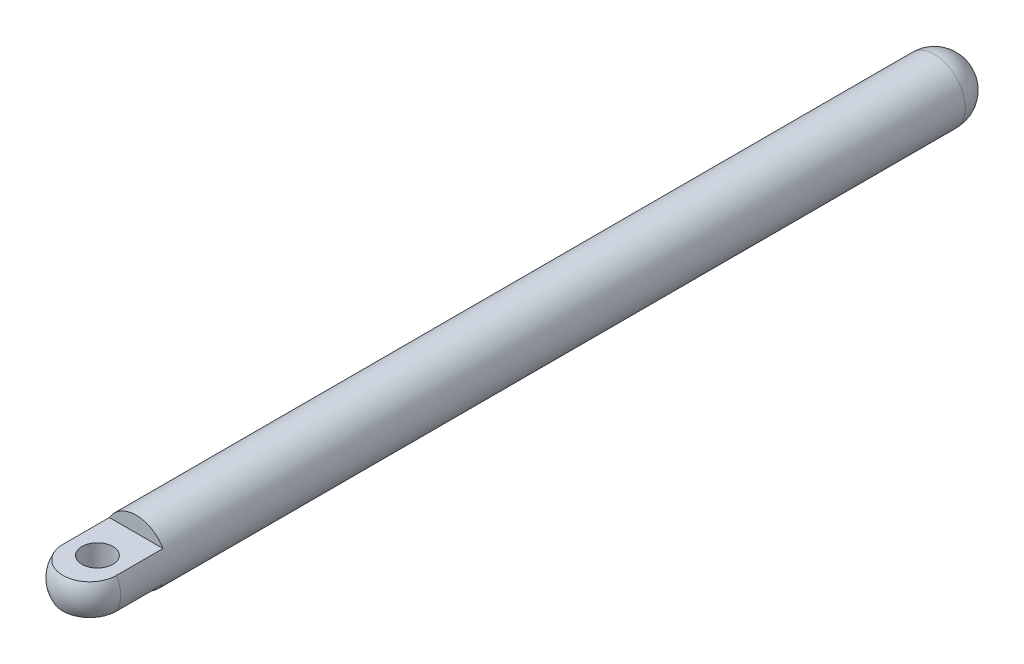
ISO-10303-21;
HEADER;
FILE_DESCRIPTION(('STEP AP214'),'2;1');
FILE_NAME('part.step','',(''),(''),'','','');
FILE_SCHEMA(('AUTOMOTIVE_DESIGN { 1 0 10303 214 1 1 1 1 }'));
ENDSEC;
DATA;
#1=APPLICATION_CONTEXT('core data for automotive mechanical design processes');
#2=APPLICATION_PROTOCOL_DEFINITION('international standard','automotive_design',2000,#1);
#3=PRODUCT_CONTEXT('',#1,'mechanical');
#4=PRODUCT('Part','Part','',(#3));
#5=PRODUCT_RELATED_PRODUCT_CATEGORY('part','',(#4));
#6=PRODUCT_DEFINITION_FORMATION('','',#4);
#7=PRODUCT_DEFINITION_CONTEXT('part definition',#1,'design');
#8=PRODUCT_DEFINITION('design','',#6,#7);
#9=PRODUCT_DEFINITION_SHAPE('','',#8);
#10=(LENGTH_UNIT() NAMED_UNIT(*) SI_UNIT(.MILLI.,.METRE.));
#11=(NAMED_UNIT(*) PLANE_ANGLE_UNIT() SI_UNIT($,.RADIAN.));
#12=(NAMED_UNIT(*) SI_UNIT($,.STERADIAN.) SOLID_ANGLE_UNIT());
#13=UNCERTAINTY_MEASURE_WITH_UNIT(LENGTH_MEASURE(1.E-05),#10,'distance_accuracy_value','');
#14=(GEOMETRIC_REPRESENTATION_CONTEXT(3) GLOBAL_UNCERTAINTY_ASSIGNED_CONTEXT((#13)) GLOBAL_UNIT_ASSIGNED_CONTEXT((#10,
#11,#12)) REPRESENTATION_CONTEXT('',''));
#15=CARTESIAN_POINT('',(0.,0.,0.));
#16=DIRECTION('',(0.,0.,1.));
#17=DIRECTION('',(1.,0.,0.));
#18=AXIS2_PLACEMENT_3D('',#15,#16,#17);
#19=CARTESIAN_POINT('',(0.,0.,110.));
#20=DIRECTION('',(0.,0.,-1.));
#21=DIRECTION('',(-1.,0.,0.));
#22=AXIS2_PLACEMENT_3D('',#19,#20,#21);
#23=CYLINDRICAL_SURFACE('',#22,4.);
#24=CARTESIAN_POINT('',(0.,0.,-3.));
#25=DIRECTION('',(0.,0.,-1.));
#26=DIRECTION('',(-1.,0.,0.));
#27=AXIS2_PLACEMENT_3D('',#24,#25,#26);
#28=CIRCLE('',#27,4.);
#29=CARTESIAN_POINT('',(-4.,0.,-3.));
#30=VERTEX_POINT('',#29);
#31=EDGE_CURVE('E11',#30,#30,#28,.F.);
#32=ORIENTED_EDGE('',*,*,#31,.T.);
#33=EDGE_LOOP('',(#32));
#34=FACE_BOUND('',#33,.T.);
#35=CARTESIAN_POINT('',(0.,0.,100.));
#36=DIRECTION('',(0.,0.,-1.));
#37=DIRECTION('',(-1.,0.,0.));
#38=AXIS2_PLACEMENT_3D('',#35,#36,#37);
#39=CIRCLE('',#38,4.);
#40=CARTESIAN_POINT('',(-3.46410161513775,2.,100.));
#41=VERTEX_POINT('',#40);
#42=CARTESIAN_POINT('',(3.46410161513775,2.,100.));
#43=VERTEX_POINT('',#42);
#44=EDGE_CURVE('E48',#41,#43,#39,.T.);
#45=ORIENTED_EDGE('',*,*,#44,.T.);
#46=DIRECTION('',(0.,0.,1.));
#47=VECTOR('',#46,1.);
#48=CARTESIAN_POINT('',(3.46410161513775,2.,100.));
#49=LINE('',#48,#47);
#50=CARTESIAN_POINT('',(3.46410161513775,2.,106.));
#51=VERTEX_POINT('',#50);
#52=EDGE_CURVE('E89',#43,#51,#49,.T.);
#53=ORIENTED_EDGE('',*,*,#52,.T.);
#54=CARTESIAN_POINT('',(0.,0.,106.));
#55=DIRECTION('',(0.,0.,-1.));
#56=DIRECTION('',(-1.,0.,0.));
#57=AXIS2_PLACEMENT_3D('',#54,#55,#56);
#58=CIRCLE('',#57,4.);
#59=CARTESIAN_POINT('',(3.46410161513775,-2.,106.));
#60=VERTEX_POINT('',#59);
#61=EDGE_CURVE('E63',#51,#60,#58,.T.);
#62=ORIENTED_EDGE('',*,*,#61,.T.);
#63=DIRECTION('',(0.,0.,-1.));
#64=VECTOR('',#63,1.);
#65=CARTESIAN_POINT('',(3.46410161513775,-2.,110.));
#66=LINE('',#65,#64);
#67=CARTESIAN_POINT('',(3.46410161513775,-2.,100.));
#68=VERTEX_POINT('',#67);
#69=EDGE_CURVE('E114',#60,#68,#66,.T.);
#70=ORIENTED_EDGE('',*,*,#69,.T.);
#71=CARTESIAN_POINT('',(0.,0.,100.));
#72=DIRECTION('',(0.,0.,-1.));
#73=DIRECTION('',(-1.,0.,0.));
#74=AXIS2_PLACEMENT_3D('',#71,#72,#73);
#75=CIRCLE('',#74,4.);
#76=CARTESIAN_POINT('',(-3.46410161513775,-2.,100.));
#77=VERTEX_POINT('',#76);
#78=EDGE_CURVE('E122',#68,#77,#75,.T.);
#79=ORIENTED_EDGE('',*,*,#78,.T.);
#80=DIRECTION('',(0.,0.,-1.));
#81=VECTOR('',#80,1.);
#82=CARTESIAN_POINT('',(-3.46410161513775,-2.,110.));
#83=LINE('',#82,#81);
#84=CARTESIAN_POINT('',(-3.46410161513775,-2.,106.));
#85=VERTEX_POINT('',#84);
#86=EDGE_CURVE('E111',#77,#85,#83,.F.);
#87=ORIENTED_EDGE('',*,*,#86,.T.);
#88=CARTESIAN_POINT('',(-3.46410161513775,2.,106.));
#89=VERTEX_POINT('',#88);
#90=EDGE_CURVE('E95',#85,#89,#58,.T.);
#91=ORIENTED_EDGE('',*,*,#90,.T.);
#92=DIRECTION('',(0.,0.,-1.));
#93=VECTOR('',#92,1.);
#94=CARTESIAN_POINT('',(-3.46410161513775,2.,100.));
#95=LINE('',#94,#93);
#96=EDGE_CURVE('E55',#89,#41,#95,.T.);
#97=ORIENTED_EDGE('',*,*,#96,.T.);
#98=EDGE_LOOP('',(#45,#53,#62,#70,#79,#87,#91,#97));
#99=FACE_BOUND('',#98,.T.);
#100=ADVANCED_FACE('F39',(#34,#99),#23,.T.);
#101=CARTESIAN_POINT('',(0.,0.,106.));
#102=DIRECTION('',(0.,0.,1.));
#103=DIRECTION('',(1.,0.,0.));
#104=AXIS2_PLACEMENT_3D('',#101,#102,#103);
#105=SPHERICAL_SURFACE('',#104,4.);
#106=ORIENTED_EDGE('',*,*,#61,.F.);
#107=CARTESIAN_POINT('',(0.,2.,106.));
#108=DIRECTION('',(0.,1.,0.));
#109=DIRECTION('',(0.,0.,1.));
#110=AXIS2_PLACEMENT_3D('',#107,#108,#109);
#111=CIRCLE('',#110,3.46410161513775);
#112=EDGE_CURVE('E87',#51,#89,#111,.F.);
#113=ORIENTED_EDGE('',*,*,#112,.T.);
#114=ORIENTED_EDGE('',*,*,#90,.F.);
#115=CARTESIAN_POINT('',(0.,-2.,106.));
#116=DIRECTION('',(0.,1.,0.));
#117=DIRECTION('',(0.,0.,1.));
#118=AXIS2_PLACEMENT_3D('',#115,#116,#117);
#119=CIRCLE('',#118,3.46410161513775);
#120=EDGE_CURVE('E119',#60,#85,#119,.F.);
#121=ORIENTED_EDGE('',*,*,#120,.F.);
#122=EDGE_LOOP('',(#106,#113,#114,#121));
#123=FACE_BOUND('',#122,.T.);
#124=ADVANCED_FACE('F128',(#123),#105,.T.);
#125=CARTESIAN_POINT('',(-4.,-4.,100.));
#126=DIRECTION('',(0.,0.,-1.));
#127=DIRECTION('',(-1.,0.,0.));
#128=AXIS2_PLACEMENT_3D('',#125,#126,#127);
#129=PLANE('',#128);
#130=DIRECTION('',(-1.,0.,0.));
#131=VECTOR('',#130,1.);
#132=CARTESIAN_POINT('',(-4.,-2.,100.));
#133=LINE('',#132,#131);
#134=EDGE_CURVE('E107',#68,#77,#133,.T.);
#135=ORIENTED_EDGE('',*,*,#134,.T.);
#136=ORIENTED_EDGE('',*,*,#78,.F.);
#137=EDGE_LOOP('',(#135,#136));
#138=FACE_BOUND('',#137,.T.);
#139=ADVANCED_FACE('F135',(#138),#129,.F.);
#140=CARTESIAN_POINT('',(0.,-2.,0.));
#141=DIRECTION('',(0.,1.,0.));
#142=DIRECTION('',(0.,0.,1.));
#143=AXIS2_PLACEMENT_3D('',#140,#141,#142);
#144=PLANE('',#143);
#145=CARTESIAN_POINT('',(0.,-2.,105.));
#146=DIRECTION('',(0.,-1.,0.));
#147=DIRECTION('',(0.,0.,-1.));
#148=AXIS2_PLACEMENT_3D('',#145,#146,#147);
#149=CIRCLE('',#148,2.);
#150=CARTESIAN_POINT('',(0.,-2.,103.));
#151=VERTEX_POINT('',#150);
#152=EDGE_CURVE('E97',#151,#151,#149,.T.);
#153=ORIENTED_EDGE('',*,*,#152,.F.);
#154=EDGE_LOOP('',(#153));
#155=FACE_BOUND('',#154,.T.);
#156=ORIENTED_EDGE('',*,*,#120,.T.);
#157=ORIENTED_EDGE('',*,*,#86,.F.);
#158=ORIENTED_EDGE('',*,*,#134,.F.);
#159=ORIENTED_EDGE('',*,*,#69,.F.);
#160=EDGE_LOOP('',(#156,#157,#158,#159));
#161=FACE_BOUND('',#160,.T.);
#162=ADVANCED_FACE('F132',(#155,#161),#144,.F.);
#163=CARTESIAN_POINT('',(-3.46410161513775,4.,100.));
#164=DIRECTION('',(0.,0.,-1.));
#165=DIRECTION('',(-1.,0.,0.));
#166=AXIS2_PLACEMENT_3D('',#163,#164,#165);
#167=PLANE('',#166);
#168=DIRECTION('',(1.,0.,0.));
#169=VECTOR('',#168,1.);
#170=CARTESIAN_POINT('',(-3.46410161513775,2.,100.));
#171=LINE('',#170,#169);
#172=EDGE_CURVE('E84',#41,#43,#171,.T.);
#173=ORIENTED_EDGE('',*,*,#172,.T.);
#174=ORIENTED_EDGE('',*,*,#44,.F.);
#175=EDGE_LOOP('',(#173,#174));
#176=FACE_BOUND('',#175,.T.);
#177=ADVANCED_FACE('F83',(#176),#167,.F.);
#178=CARTESIAN_POINT('',(0.,2.,0.));
#179=DIRECTION('',(0.,1.,0.));
#180=DIRECTION('',(0.,0.,1.));
#181=AXIS2_PLACEMENT_3D('',#178,#179,#180);
#182=PLANE('',#181);
#183=CARTESIAN_POINT('',(0.,2.,105.));
#184=DIRECTION('',(0.,1.,0.));
#185=DIRECTION('',(0.,0.,1.));
#186=AXIS2_PLACEMENT_3D('',#183,#184,#185);
#187=CIRCLE('',#186,2.);
#188=CARTESIAN_POINT('',(0.,2.,103.));
#189=VERTEX_POINT('',#188);
#190=EDGE_CURVE('E101',#189,#189,#187,.F.);
#191=ORIENTED_EDGE('',*,*,#190,.T.);
#192=EDGE_LOOP('',(#191));
#193=FACE_BOUND('',#192,.T.);
#194=ORIENTED_EDGE('',*,*,#52,.F.);
#195=ORIENTED_EDGE('',*,*,#172,.F.);
#196=ORIENTED_EDGE('',*,*,#96,.F.);
#197=ORIENTED_EDGE('',*,*,#112,.F.);
#198=EDGE_LOOP('',(#194,#195,#196,#197));
#199=FACE_BOUND('',#198,.T.);
#200=ADVANCED_FACE('F88',(#193,#199),#182,.T.);
#201=CARTESIAN_POINT('',(0.,4.001,105.));
#202=DIRECTION('',(0.,-1.,0.));
#203=DIRECTION('',(0.,0.,-1.));
#204=AXIS2_PLACEMENT_3D('',#201,#202,#203);
#205=CYLINDRICAL_SURFACE('',#204,2.);
#206=CARTESIAN_POINT('',(0.,2.,103.));
#207=CARTESIAN_POINT('',(0.,1.95833333333333,103.));
#208=CARTESIAN_POINT('',(0.,1.91666666666667,103.));
#209=CARTESIAN_POINT('',(0.,1.83333333333333,103.));
#210=CARTESIAN_POINT('',(0.,1.79166666666667,103.));
#211=CARTESIAN_POINT('',(0.,1.70833333333333,103.));
#212=CARTESIAN_POINT('',(0.,1.66666666666667,103.));
#213=CARTESIAN_POINT('',(0.,1.58333333333333,103.));
#214=CARTESIAN_POINT('',(0.,1.54166666666667,103.));
#215=CARTESIAN_POINT('',(0.,1.45833333333333,103.));
#216=CARTESIAN_POINT('',(0.,1.41666666666667,103.));
#217=CARTESIAN_POINT('',(0.,1.33333333333333,103.));
#218=CARTESIAN_POINT('',(0.,1.29166666666667,103.));
#219=CARTESIAN_POINT('',(0.,1.20833333333333,103.));
#220=CARTESIAN_POINT('',(0.,1.16666666666667,103.));
#221=CARTESIAN_POINT('',(0.,1.08333333333333,103.));
#222=CARTESIAN_POINT('',(0.,1.04166666666667,103.));
#223=CARTESIAN_POINT('',(0.,0.958333333333333,103.));
#224=CARTESIAN_POINT('',(0.,0.916666666666666,103.));
#225=CARTESIAN_POINT('',(0.,0.833333333333333,103.));
#226=CARTESIAN_POINT('',(0.,0.791666666666666,103.));
#227=CARTESIAN_POINT('',(0.,0.708333333333333,103.));
#228=CARTESIAN_POINT('',(0.,0.666666666666666,103.));
#229=CARTESIAN_POINT('',(0.,0.583333333333333,103.));
#230=CARTESIAN_POINT('',(0.,0.541666666666666,103.));
#231=CARTESIAN_POINT('',(0.,0.458333333333333,103.));
#232=CARTESIAN_POINT('',(0.,0.416666666666666,103.));
#233=CARTESIAN_POINT('',(0.,0.333333333333333,103.));
#234=CARTESIAN_POINT('',(0.,0.291666666666666,103.));
#235=CARTESIAN_POINT('',(0.,0.208333333333333,103.));
#236=CARTESIAN_POINT('',(0.,0.166666666666666,103.));
#237=CARTESIAN_POINT('',(0.,0.0833333333333331,103.));
#238=CARTESIAN_POINT('',(0.,0.0416666666666666,103.));
#239=CARTESIAN_POINT('',(0.,-0.0416666666666667,103.));
#240=CARTESIAN_POINT('',(0.,-0.0833333333333334,103.));
#241=CARTESIAN_POINT('',(0.,-0.166666666666667,103.));
#242=CARTESIAN_POINT('',(0.,-0.208333333333334,103.));
#243=CARTESIAN_POINT('',(0.,-0.291666666666667,103.));
#244=CARTESIAN_POINT('',(0.,-0.333333333333334,103.));
#245=CARTESIAN_POINT('',(0.,-0.416666666666667,103.));
#246=CARTESIAN_POINT('',(0.,-0.458333333333334,103.));
#247=CARTESIAN_POINT('',(0.,-0.541666666666667,103.));
#248=CARTESIAN_POINT('',(0.,-0.583333333333334,103.));
#249=CARTESIAN_POINT('',(0.,-0.666666666666667,103.));
#250=CARTESIAN_POINT('',(0.,-0.708333333333333,103.));
#251=CARTESIAN_POINT('',(0.,-0.791666666666667,103.));
#252=CARTESIAN_POINT('',(0.,-0.833333333333333,103.));
#253=CARTESIAN_POINT('',(0.,-0.916666666666667,103.));
#254=CARTESIAN_POINT('',(0.,-0.958333333333333,103.));
#255=CARTESIAN_POINT('',(0.,-1.04166666666667,103.));
#256=CARTESIAN_POINT('',(0.,-1.08333333333333,103.));
#257=CARTESIAN_POINT('',(0.,-1.16666666666667,103.));
#258=CARTESIAN_POINT('',(0.,-1.20833333333333,103.));
#259=CARTESIAN_POINT('',(0.,-1.29166666666667,103.));
#260=CARTESIAN_POINT('',(0.,-1.33333333333333,103.));
#261=CARTESIAN_POINT('',(0.,-1.41666666666667,103.));
#262=CARTESIAN_POINT('',(0.,-1.45833333333333,103.));
#263=CARTESIAN_POINT('',(0.,-1.54166666666667,103.));
#264=CARTESIAN_POINT('',(0.,-1.58333333333333,103.));
#265=CARTESIAN_POINT('',(0.,-1.66666666666667,103.));
#266=CARTESIAN_POINT('',(0.,-1.70833333333333,103.));
#267=CARTESIAN_POINT('',(0.,-1.79166666666667,103.));
#268=CARTESIAN_POINT('',(0.,-1.83333333333333,103.));
#269=CARTESIAN_POINT('',(0.,-1.91666666666667,103.));
#270=CARTESIAN_POINT('',(0.,-1.95833333333333,103.));
#271=CARTESIAN_POINT('',(0.,-2.,103.));
#272=B_SPLINE_CURVE_WITH_KNOTS('',3,(#206,#207,#208,#209,#210,#211,#212,#213,#214,#215,#216,
#217,#218,#219,#220,#221,#222,#223,#224,#225,#226,#227,#228,#229,#230,#231,#232,#233,#234,#235,
#236,#237,#238,#239,#240,#241,#242,#243,#244,#245,#246,#247,#248,#249,#250,#251,#252,#253,#254,
#255,#256,#257,#258,#259,#260,#261,#262,#263,#264,#265,#266,#267,#268,#269,#270,#271),
.UNSPECIFIED.,.F.,.F.,(4,2,2,2,2,2,2,2,2,2,2,2,2,2,2,2,2,2,2,2,2,2,2,2,2,2,2,2,2,2,2,2,4),(0.,
0.125,0.25,0.375,0.5,0.625,0.75,0.875,1.,1.125,1.25,1.375,1.5,1.625,1.75,1.875,2.,2.125,2.25,
2.375,2.5,2.625,2.75,2.875,3.,3.125,3.25,3.375,3.5,3.625,3.75,3.875,4.),.UNSPECIFIED.);
#273=EDGE_CURVE('BSEAM152',#189,#151,#272,.T.);
#274=ORIENTED_EDGE('',*,*,#190,.F.);
#275=ORIENTED_EDGE('',*,*,#152,.T.);
#276=ORIENTED_EDGE('',*,*,#273,.T.);
#277=ORIENTED_EDGE('',*,*,#273,.F.);
#278=EDGE_LOOP('',(#274,#276,#275,#277));
#279=FACE_BOUND('',#278,.T.);
#280=ADVANCED_FACE('F152',(#279),#205,.F.);
#281=CARTESIAN_POINT('',(0.,0.,-3.));
#282=DIRECTION('',(0.,0.,-1.));
#283=DIRECTION('',(-1.,0.,0.));
#284=AXIS2_PLACEMENT_3D('',#281,#282,#283);
#285=SPHERICAL_SURFACE('',#284,4.);
#286=ORIENTED_EDGE('',*,*,#31,.F.);
#287=EDGE_LOOP('',(#286));
#288=FACE_BOUND('',#287,.T.);
#289=ADVANCED_FACE('F41',(#288),#285,.T.);
#290=CLOSED_SHELL('',(#100,#124,#139,#162,#177,#200,#280,#289));
#291=MANIFOLD_SOLID_BREP('B2',#290);
#292=ADVANCED_BREP_SHAPE_REPRESENTATION('',(#18,#291),#14);
#293=SHAPE_DEFINITION_REPRESENTATION(#9,#292);
ENDSEC;
END-ISO-10303-21;
